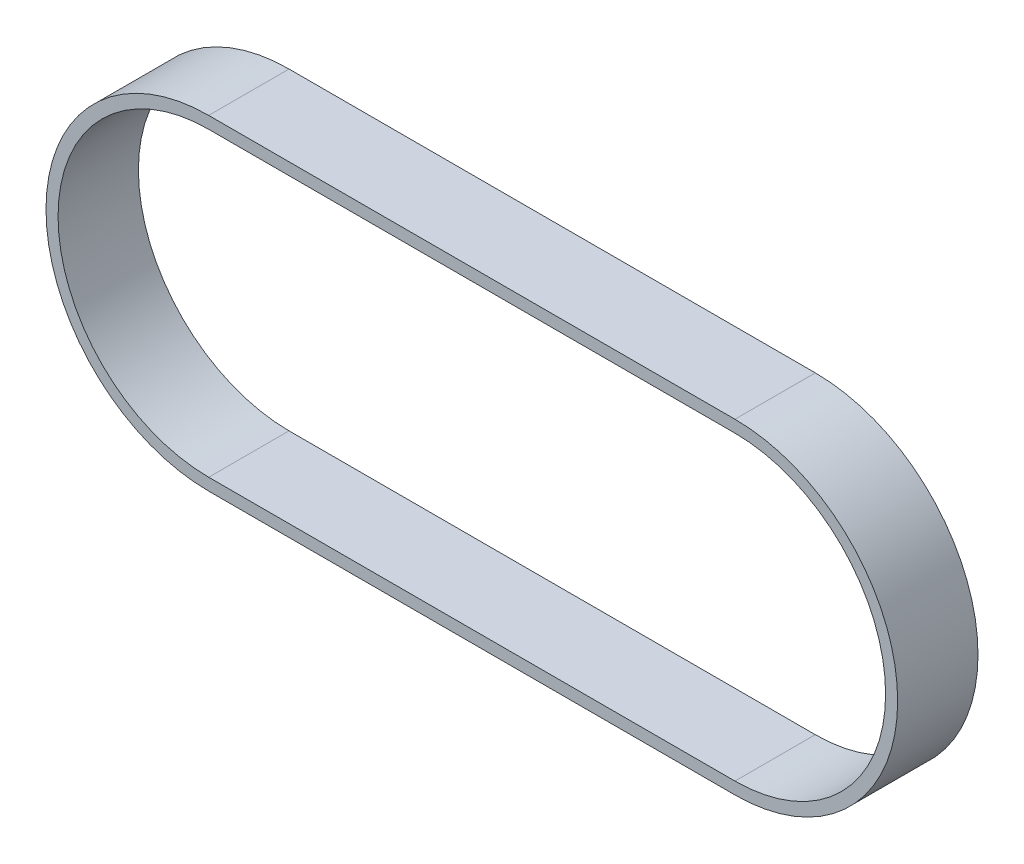
ISO-10303-21;
HEADER;
FILE_DESCRIPTION(('STEP AP214'),'2;1');
FILE_NAME('part.step','',(''),(''),'','','');
FILE_SCHEMA(('AUTOMOTIVE_DESIGN { 1 0 10303 214 1 1 1 1 }'));
ENDSEC;
DATA;
#1=APPLICATION_CONTEXT('core data for automotive mechanical design processes');
#2=APPLICATION_PROTOCOL_DEFINITION('international standard','automotive_design',2000,#1);
#3=PRODUCT_CONTEXT('',#1,'mechanical');
#4=PRODUCT('Part','Part','',(#3));
#5=PRODUCT_RELATED_PRODUCT_CATEGORY('part','',(#4));
#6=PRODUCT_DEFINITION_FORMATION('','',#4);
#7=PRODUCT_DEFINITION_CONTEXT('part definition',#1,'design');
#8=PRODUCT_DEFINITION('design','',#6,#7);
#9=PRODUCT_DEFINITION_SHAPE('','',#8);
#10=(LENGTH_UNIT() NAMED_UNIT(*) SI_UNIT(.MILLI.,.METRE.));
#11=(NAMED_UNIT(*) PLANE_ANGLE_UNIT() SI_UNIT($,.RADIAN.));
#12=(NAMED_UNIT(*) SI_UNIT($,.STERADIAN.) SOLID_ANGLE_UNIT());
#13=UNCERTAINTY_MEASURE_WITH_UNIT(LENGTH_MEASURE(1.E-05),#10,'distance_accuracy_value','');
#14=(GEOMETRIC_REPRESENTATION_CONTEXT(3) GLOBAL_UNCERTAINTY_ASSIGNED_CONTEXT((#13)) GLOBAL_UNIT_ASSIGNED_CONTEXT((#10,
#11,#12)) REPRESENTATION_CONTEXT('',''));
#15=CARTESIAN_POINT('',(0.,0.,0.));
#16=DIRECTION('',(0.,0.,1.));
#17=DIRECTION('',(1.,0.,0.));
#18=AXIS2_PLACEMENT_3D('',#15,#16,#17);
#19=CARTESIAN_POINT('',(0.,0.,20.));
#20=DIRECTION('',(0.,0.,1.));
#21=DIRECTION('',(1.,0.,0.));
#22=AXIS2_PLACEMENT_3D('',#19,#20,#21);
#23=PLANE('',#22);
#24=CARTESIAN_POINT('',(0.,0.,20.));
#25=DIRECTION('',(0.,0.,1.));
#26=DIRECTION('',(1.,0.,0.));
#27=AXIS2_PLACEMENT_3D('',#24,#25,#26);
#28=CIRCLE('',#27,40.5);
#29=CARTESIAN_POINT('',(0.,40.5,20.));
#30=VERTEX_POINT('',#29);
#31=CARTESIAN_POINT('',(0.,-40.5,20.));
#32=VERTEX_POINT('',#31);
#33=EDGE_CURVE('E117',#30,#32,#28,.T.);
#34=ORIENTED_EDGE('',*,*,#33,.T.);
#35=DIRECTION('',(1.,0.,0.));
#36=VECTOR('',#35,1.);
#37=CARTESIAN_POINT('',(0.,-40.5,20.));
#38=LINE('',#37,#36);
#39=CARTESIAN_POINT('',(131.,-40.5,20.));
#40=VERTEX_POINT('',#39);
#41=EDGE_CURVE('E120',#32,#40,#38,.T.);
#42=ORIENTED_EDGE('',*,*,#41,.T.);
#43=CARTESIAN_POINT('',(131.,0.,20.));
#44=DIRECTION('',(0.,0.,1.));
#45=DIRECTION('',(1.,0.,0.));
#46=AXIS2_PLACEMENT_3D('',#43,#44,#45);
#47=CIRCLE('',#46,40.5);
#48=CARTESIAN_POINT('',(131.,40.5,20.));
#49=VERTEX_POINT('',#48);
#50=EDGE_CURVE('E124',#40,#49,#47,.T.);
#51=ORIENTED_EDGE('',*,*,#50,.T.);
#52=DIRECTION('',(-1.,0.,0.));
#53=VECTOR('',#52,1.);
#54=CARTESIAN_POINT('',(0.,40.5,20.));
#55=LINE('',#54,#53);
#56=EDGE_CURVE('E123',#49,#30,#55,.T.);
#57=ORIENTED_EDGE('',*,*,#56,.T.);
#58=EDGE_LOOP('',(#34,#42,#51,#57));
#59=FACE_BOUND('',#58,.T.);
#60=DIRECTION('',(1.,0.,0.));
#61=VECTOR('',#60,1.);
#62=CARTESIAN_POINT('',(0.,-37.5,20.));
#63=LINE('',#62,#61);
#64=CARTESIAN_POINT('',(0.,-37.5,20.));
#65=VERTEX_POINT('',#64);
#66=CARTESIAN_POINT('',(131.,-37.5,20.));
#67=VERTEX_POINT('',#66);
#68=EDGE_CURVE('E90',#65,#67,#63,.T.);
#69=ORIENTED_EDGE('',*,*,#68,.F.);
#70=CARTESIAN_POINT('',(0.,0.,20.));
#71=DIRECTION('',(0.,0.,1.));
#72=DIRECTION('',(1.,0.,0.));
#73=AXIS2_PLACEMENT_3D('',#70,#71,#72);
#74=CIRCLE('',#73,37.5);
#75=CARTESIAN_POINT('',(0.,37.5,20.));
#76=VERTEX_POINT('',#75);
#77=EDGE_CURVE('E81',#76,#65,#74,.T.);
#78=ORIENTED_EDGE('',*,*,#77,.F.);
#79=DIRECTION('',(-1.,0.,0.));
#80=VECTOR('',#79,1.);
#81=CARTESIAN_POINT('',(0.,37.5,20.));
#82=LINE('',#81,#80);
#83=CARTESIAN_POINT('',(131.,37.5,20.));
#84=VERTEX_POINT('',#83);
#85=EDGE_CURVE('E103',#84,#76,#82,.T.);
#86=ORIENTED_EDGE('',*,*,#85,.F.);
#87=CARTESIAN_POINT('',(131.,0.,20.));
#88=DIRECTION('',(0.,0.,1.));
#89=DIRECTION('',(1.,0.,0.));
#90=AXIS2_PLACEMENT_3D('',#87,#88,#89);
#91=CIRCLE('',#90,37.5);
#92=EDGE_CURVE('E101',#67,#84,#91,.T.);
#93=ORIENTED_EDGE('',*,*,#92,.F.);
#94=EDGE_LOOP('',(#69,#78,#86,#93));
#95=FACE_BOUND('',#94,.T.);
#96=ADVANCED_FACE('F16',(#59,#95),#23,.T.);
#97=CARTESIAN_POINT('',(0.,0.,0.));
#98=DIRECTION('',(0.,0.,1.));
#99=DIRECTION('',(1.,0.,0.));
#100=AXIS2_PLACEMENT_3D('',#97,#98,#99);
#101=PLANE('',#100);
#102=CARTESIAN_POINT('',(0.,0.,0.));
#103=DIRECTION('',(0.,0.,1.));
#104=DIRECTION('',(1.,0.,0.));
#105=AXIS2_PLACEMENT_3D('',#102,#103,#104);
#106=CIRCLE('',#105,40.5);
#107=CARTESIAN_POINT('',(0.,40.5,0.));
#108=VERTEX_POINT('',#107);
#109=CARTESIAN_POINT('',(0.,-40.5,0.));
#110=VERTEX_POINT('',#109);
#111=EDGE_CURVE('E100',#108,#110,#106,.T.);
#112=ORIENTED_EDGE('',*,*,#111,.F.);
#113=DIRECTION('',(-1.,0.,0.));
#114=VECTOR('',#113,1.);
#115=CARTESIAN_POINT('',(0.,40.5,0.));
#116=LINE('',#115,#114);
#117=CARTESIAN_POINT('',(131.,40.5,0.));
#118=VERTEX_POINT('',#117);
#119=EDGE_CURVE('E122',#118,#108,#116,.T.);
#120=ORIENTED_EDGE('',*,*,#119,.F.);
#121=CARTESIAN_POINT('',(131.,0.,0.));
#122=DIRECTION('',(0.,0.,1.));
#123=DIRECTION('',(1.,0.,0.));
#124=AXIS2_PLACEMENT_3D('',#121,#122,#123);
#125=CIRCLE('',#124,40.5);
#126=CARTESIAN_POINT('',(131.,-40.5,0.));
#127=VERTEX_POINT('',#126);
#128=EDGE_CURVE('E135',#127,#118,#125,.T.);
#129=ORIENTED_EDGE('',*,*,#128,.F.);
#130=DIRECTION('',(1.,0.,0.));
#131=VECTOR('',#130,1.);
#132=CARTESIAN_POINT('',(0.,-40.5,0.));
#133=LINE('',#132,#131);
#134=EDGE_CURVE('E129',#110,#127,#133,.T.);
#135=ORIENTED_EDGE('',*,*,#134,.F.);
#136=EDGE_LOOP('',(#112,#120,#129,#135));
#137=FACE_BOUND('',#136,.T.);
#138=CARTESIAN_POINT('',(0.,0.,0.));
#139=DIRECTION('',(0.,0.,1.));
#140=DIRECTION('',(1.,0.,0.));
#141=AXIS2_PLACEMENT_3D('',#138,#139,#140);
#142=CIRCLE('',#141,37.5);
#143=CARTESIAN_POINT('',(0.,37.5,0.));
#144=VERTEX_POINT('',#143);
#145=CARTESIAN_POINT('',(0.,-37.5,0.));
#146=VERTEX_POINT('',#145);
#147=EDGE_CURVE('E39',#144,#146,#142,.T.);
#148=ORIENTED_EDGE('',*,*,#147,.T.);
#149=DIRECTION('',(1.,0.,0.));
#150=VECTOR('',#149,1.);
#151=CARTESIAN_POINT('',(0.,-37.5,0.));
#152=LINE('',#151,#150);
#153=CARTESIAN_POINT('',(131.,-37.5,0.));
#154=VERTEX_POINT('',#153);
#155=EDGE_CURVE('E96',#146,#154,#152,.T.);
#156=ORIENTED_EDGE('',*,*,#155,.T.);
#157=CARTESIAN_POINT('',(131.,0.,0.));
#158=DIRECTION('',(0.,0.,1.));
#159=DIRECTION('',(1.,0.,0.));
#160=AXIS2_PLACEMENT_3D('',#157,#158,#159);
#161=CIRCLE('',#160,37.5);
#162=CARTESIAN_POINT('',(131.,37.5,0.));
#163=VERTEX_POINT('',#162);
#164=EDGE_CURVE('E108',#154,#163,#161,.T.);
#165=ORIENTED_EDGE('',*,*,#164,.T.);
#166=DIRECTION('',(-1.,0.,0.));
#167=VECTOR('',#166,1.);
#168=CARTESIAN_POINT('',(0.,37.5,0.));
#169=LINE('',#168,#167);
#170=EDGE_CURVE('E89',#163,#144,#169,.T.);
#171=ORIENTED_EDGE('',*,*,#170,.T.);
#172=EDGE_LOOP('',(#148,#156,#165,#171));
#173=FACE_BOUND('',#172,.T.);
#174=ADVANCED_FACE('F147',(#137,#173),#101,.F.);
#175=CARTESIAN_POINT('',(0.,0.,20.));
#176=DIRECTION('',(0.,0.,-1.));
#177=DIRECTION('',(-1.,0.,0.));
#178=AXIS2_PLACEMENT_3D('',#175,#176,#177);
#179=CYLINDRICAL_SURFACE('',#178,40.5);
#180=ORIENTED_EDGE('',*,*,#111,.T.);
#181=DIRECTION('',(0.,0.,-1.));
#182=VECTOR('',#181,1.);
#183=CARTESIAN_POINT('',(0.,-40.5,20.));
#184=LINE('',#183,#182);
#185=EDGE_CURVE('E11',#32,#110,#184,.T.);
#186=ORIENTED_EDGE('',*,*,#185,.F.);
#187=ORIENTED_EDGE('',*,*,#33,.F.);
#188=DIRECTION('',(0.,0.,-1.));
#189=VECTOR('',#188,1.);
#190=CARTESIAN_POINT('',(0.,40.5,20.));
#191=LINE('',#190,#189);
#192=EDGE_CURVE('E126',#30,#108,#191,.T.);
#193=ORIENTED_EDGE('',*,*,#192,.T.);
#194=EDGE_LOOP('',(#180,#186,#187,#193));
#195=FACE_BOUND('',#194,.T.);
#196=ADVANCED_FACE('F18',(#195),#179,.T.);
#197=CARTESIAN_POINT('',(0.,-40.5,20.));
#198=DIRECTION('',(0.,1.,0.));
#199=DIRECTION('',(0.,0.,1.));
#200=AXIS2_PLACEMENT_3D('',#197,#198,#199);
#201=PLANE('',#200);
#202=ORIENTED_EDGE('',*,*,#134,.T.);
#203=DIRECTION('',(0.,0.,-1.));
#204=VECTOR('',#203,1.);
#205=CARTESIAN_POINT('',(131.,-40.5,20.));
#206=LINE('',#205,#204);
#207=EDGE_CURVE('E24',#40,#127,#206,.T.);
#208=ORIENTED_EDGE('',*,*,#207,.F.);
#209=ORIENTED_EDGE('',*,*,#41,.F.);
#210=ORIENTED_EDGE('',*,*,#185,.T.);
#211=EDGE_LOOP('',(#202,#208,#209,#210));
#212=FACE_BOUND('',#211,.T.);
#213=ADVANCED_FACE('F159',(#212),#201,.F.);
#214=CARTESIAN_POINT('',(131.,0.,20.));
#215=DIRECTION('',(0.,0.,-1.));
#216=DIRECTION('',(-1.,0.,0.));
#217=AXIS2_PLACEMENT_3D('',#214,#215,#216);
#218=CYLINDRICAL_SURFACE('',#217,40.5);
#219=ORIENTED_EDGE('',*,*,#128,.T.);
#220=DIRECTION('',(0.,0.,-1.));
#221=VECTOR('',#220,1.);
#222=CARTESIAN_POINT('',(131.,40.5,20.));
#223=LINE('',#222,#221);
#224=EDGE_CURVE('E140',#49,#118,#223,.T.);
#225=ORIENTED_EDGE('',*,*,#224,.F.);
#226=ORIENTED_EDGE('',*,*,#50,.F.);
#227=ORIENTED_EDGE('',*,*,#207,.T.);
#228=EDGE_LOOP('',(#219,#225,#226,#227));
#229=FACE_BOUND('',#228,.T.);
#230=ADVANCED_FACE('F145',(#229),#218,.T.);
#231=CARTESIAN_POINT('',(0.,40.5,20.));
#232=DIRECTION('',(0.,-1.,0.));
#233=DIRECTION('',(1.,0.,0.));
#234=AXIS2_PLACEMENT_3D('',#231,#232,#233);
#235=PLANE('',#234);
#236=ORIENTED_EDGE('',*,*,#119,.T.);
#237=ORIENTED_EDGE('',*,*,#192,.F.);
#238=ORIENTED_EDGE('',*,*,#56,.F.);
#239=ORIENTED_EDGE('',*,*,#224,.T.);
#240=EDGE_LOOP('',(#236,#237,#238,#239));
#241=FACE_BOUND('',#240,.T.);
#242=ADVANCED_FACE('F152',(#241),#235,.F.);
#243=CARTESIAN_POINT('',(0.,0.,20.));
#244=DIRECTION('',(0.,0.,-1.));
#245=DIRECTION('',(-1.,0.,0.));
#246=AXIS2_PLACEMENT_3D('',#243,#244,#245);
#247=CYLINDRICAL_SURFACE('',#246,37.5);
#248=ORIENTED_EDGE('',*,*,#147,.F.);
#249=DIRECTION('',(0.,0.,-1.));
#250=VECTOR('',#249,1.);
#251=CARTESIAN_POINT('',(0.,37.5,20.));
#252=LINE('',#251,#250);
#253=EDGE_CURVE('E84',#76,#144,#252,.T.);
#254=ORIENTED_EDGE('',*,*,#253,.F.);
#255=ORIENTED_EDGE('',*,*,#77,.T.);
#256=DIRECTION('',(0.,0.,-1.));
#257=VECTOR('',#256,1.);
#258=CARTESIAN_POINT('',(0.,-37.5,20.));
#259=LINE('',#258,#257);
#260=EDGE_CURVE('E82',#65,#146,#259,.T.);
#261=ORIENTED_EDGE('',*,*,#260,.T.);
#262=EDGE_LOOP('',(#248,#254,#255,#261));
#263=FACE_BOUND('',#262,.T.);
#264=ADVANCED_FACE('F83',(#263),#247,.F.);
#265=CARTESIAN_POINT('',(0.,-37.5,20.));
#266=DIRECTION('',(0.,1.,0.));
#267=DIRECTION('',(0.,0.,1.));
#268=AXIS2_PLACEMENT_3D('',#265,#266,#267);
#269=PLANE('',#268);
#270=ORIENTED_EDGE('',*,*,#155,.F.);
#271=ORIENTED_EDGE('',*,*,#260,.F.);
#272=ORIENTED_EDGE('',*,*,#68,.T.);
#273=DIRECTION('',(0.,0.,-1.));
#274=VECTOR('',#273,1.);
#275=CARTESIAN_POINT('',(131.,-37.5,20.));
#276=LINE('',#275,#274);
#277=EDGE_CURVE('E98',#67,#154,#276,.T.);
#278=ORIENTED_EDGE('',*,*,#277,.T.);
#279=EDGE_LOOP('',(#270,#271,#272,#278));
#280=FACE_BOUND('',#279,.T.);
#281=ADVANCED_FACE('F91',(#280),#269,.T.);
#282=CARTESIAN_POINT('',(131.,0.,20.));
#283=DIRECTION('',(0.,0.,-1.));
#284=DIRECTION('',(-1.,0.,0.));
#285=AXIS2_PLACEMENT_3D('',#282,#283,#284);
#286=CYLINDRICAL_SURFACE('',#285,37.5);
#287=ORIENTED_EDGE('',*,*,#164,.F.);
#288=ORIENTED_EDGE('',*,*,#277,.F.);
#289=ORIENTED_EDGE('',*,*,#92,.T.);
#290=DIRECTION('',(0.,0.,-1.));
#291=VECTOR('',#290,1.);
#292=CARTESIAN_POINT('',(131.,37.5,20.));
#293=LINE('',#292,#291);
#294=EDGE_CURVE('E33',#84,#163,#293,.T.);
#295=ORIENTED_EDGE('',*,*,#294,.T.);
#296=EDGE_LOOP('',(#287,#288,#289,#295));
#297=FACE_BOUND('',#296,.T.);
#298=ADVANCED_FACE('F187',(#297),#286,.F.);
#299=CARTESIAN_POINT('',(0.,37.5,20.));
#300=DIRECTION('',(0.,-1.,0.));
#301=DIRECTION('',(1.,0.,0.));
#302=AXIS2_PLACEMENT_3D('',#299,#300,#301);
#303=PLANE('',#302);
#304=ORIENTED_EDGE('',*,*,#170,.F.);
#305=ORIENTED_EDGE('',*,*,#294,.F.);
#306=ORIENTED_EDGE('',*,*,#85,.T.);
#307=ORIENTED_EDGE('',*,*,#253,.T.);
#308=EDGE_LOOP('',(#304,#305,#306,#307));
#309=FACE_BOUND('',#308,.T.);
#310=ADVANCED_FACE('F193',(#309),#303,.T.);
#311=CLOSED_SHELL('',(#96,#174,#196,#213,#230,#242,#264,#281,#298,#310));
#312=MANIFOLD_SOLID_BREP('B1',#311);
#313=ADVANCED_BREP_SHAPE_REPRESENTATION('',(#18,#312),#14);
#314=SHAPE_DEFINITION_REPRESENTATION(#9,#313);
ENDSEC;
END-ISO-10303-21;
